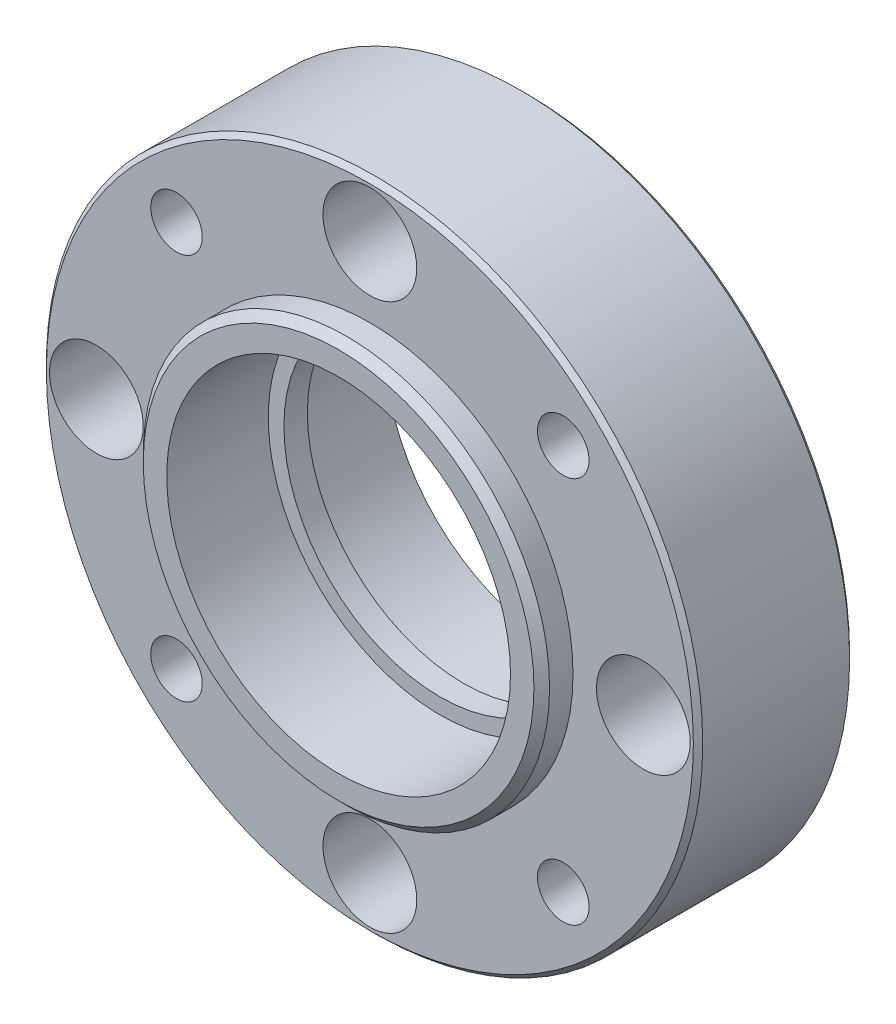
ISO-10303-21;
HEADER;
FILE_DESCRIPTION(('STEP AP214'),'2;1');
FILE_NAME('part.step','',(''),(''),'','','');
FILE_SCHEMA(('AUTOMOTIVE_DESIGN { 1 0 10303 214 1 1 1 1 }'));
ENDSEC;
DATA;
#1=APPLICATION_CONTEXT('core data for automotive mechanical design processes');
#2=APPLICATION_PROTOCOL_DEFINITION('international standard','automotive_design',2000,#1);
#3=PRODUCT_CONTEXT('',#1,'mechanical');
#4=PRODUCT('Part','Part','',(#3));
#5=PRODUCT_RELATED_PRODUCT_CATEGORY('part','',(#4));
#6=PRODUCT_DEFINITION_FORMATION('','',#4);
#7=PRODUCT_DEFINITION_CONTEXT('part definition',#1,'design');
#8=PRODUCT_DEFINITION('design','',#6,#7);
#9=PRODUCT_DEFINITION_SHAPE('','',#8);
#10=(LENGTH_UNIT() NAMED_UNIT(*) SI_UNIT(.MILLI.,.METRE.));
#11=(NAMED_UNIT(*) PLANE_ANGLE_UNIT() SI_UNIT($,.RADIAN.));
#12=(NAMED_UNIT(*) SI_UNIT($,.STERADIAN.) SOLID_ANGLE_UNIT());
#13=UNCERTAINTY_MEASURE_WITH_UNIT(LENGTH_MEASURE(1.E-05),#10,'distance_accuracy_value','');
#14=(GEOMETRIC_REPRESENTATION_CONTEXT(3) GLOBAL_UNCERTAINTY_ASSIGNED_CONTEXT((#13)) GLOBAL_UNIT_ASSIGNED_CONTEXT((#10,
#11,#12)) REPRESENTATION_CONTEXT('',''));
#15=CARTESIAN_POINT('',(0.,0.,0.));
#16=DIRECTION('',(0.,0.,1.));
#17=DIRECTION('',(1.,0.,0.));
#18=AXIS2_PLACEMENT_3D('',#15,#16,#17);
#19=CARTESIAN_POINT('',(0.,0.,-5.));
#20=DIRECTION('',(0.,0.,1.));
#21=DIRECTION('',(1.,0.,0.));
#22=AXIS2_PLACEMENT_3D('',#19,#20,#21);
#23=CYLINDRICAL_SURFACE('',#22,21.);
#24=CARTESIAN_POINT('',(0.,0.,-4.7));
#25=DIRECTION('',(0.,0.,-1.));
#26=DIRECTION('',(-1.,0.,0.));
#27=AXIS2_PLACEMENT_3D('',#24,#25,#26);
#28=CIRCLE('',#27,21.);
#29=CARTESIAN_POINT('',(21.,0.,-4.7));
#30=VERTEX_POINT('',#29);
#31=EDGE_CURVE('E60',#30,#30,#28,.F.);
#32=ORIENTED_EDGE('',*,*,#31,.T.);
#33=EDGE_LOOP('',(#32));
#34=FACE_BOUND('',#33,.T.);
#35=CARTESIAN_POINT('',(0.,0.,4.7));
#36=DIRECTION('',(0.,0.,1.));
#37=DIRECTION('',(1.,0.,0.));
#38=AXIS2_PLACEMENT_3D('',#35,#36,#37);
#39=CIRCLE('',#38,21.);
#40=CARTESIAN_POINT('',(21.,0.,4.7));
#41=VERTEX_POINT('',#40);
#42=EDGE_CURVE('E63',#41,#41,#39,.F.);
#43=ORIENTED_EDGE('',*,*,#42,.T.);
#44=EDGE_LOOP('',(#43));
#45=FACE_BOUND('',#44,.T.);
#46=ADVANCED_FACE('F34',(#34,#45),#23,.T.);
#47=CARTESIAN_POINT('',(21.,0.,-5.));
#48=DIRECTION('',(0.,0.,-1.));
#49=DIRECTION('',(-1.,0.,0.));
#50=AXIS2_PLACEMENT_3D('',#47,#48,#49);
#51=PLANE('',#50);
#52=CARTESIAN_POINT('',(0.,0.,-5.));
#53=DIRECTION('',(0.,0.,-1.));
#54=DIRECTION('',(-1.,0.,0.));
#55=AXIS2_PLACEMENT_3D('',#52,#53,#54);
#56=CIRCLE('',#55,20.7);
#57=CARTESIAN_POINT('',(20.7,0.,-5.));
#58=VERTEX_POINT('',#57);
#59=EDGE_CURVE('E57',#58,#58,#56,.T.);
#60=ORIENTED_EDGE('',*,*,#59,.T.);
#61=EDGE_LOOP('',(#60));
#62=FACE_BOUND('',#61,.T.);
#63=CARTESIAN_POINT('',(-12.3743686707646,12.3743686707646,-5.));
#64=DIRECTION('',(0.,0.,-1.));
#65=DIRECTION('',(-1.,0.,0.));
#66=AXIS2_PLACEMENT_3D('',#63,#64,#65);
#67=CIRCLE('',#66,1.64999999999999);
#68=CARTESIAN_POINT('',(-14.0243686707646,12.3743686707646,-5.));
#69=VERTEX_POINT('',#68);
#70=EDGE_CURVE('E159',#69,#69,#67,.T.);
#71=ORIENTED_EDGE('',*,*,#70,.F.);
#72=EDGE_LOOP('',(#71));
#73=FACE_BOUND('',#72,.T.);
#74=CARTESIAN_POINT('',(12.3743686707646,12.3743686707646,-5.));
#75=DIRECTION('',(0.,0.,-1.));
#76=DIRECTION('',(-1.,0.,0.));
#77=AXIS2_PLACEMENT_3D('',#74,#75,#76);
#78=CIRCLE('',#77,1.64999999999999);
#79=CARTESIAN_POINT('',(10.7243686707646,12.3743686707646,-5.));
#80=VERTEX_POINT('',#79);
#81=EDGE_CURVE('E71',#80,#80,#78,.T.);
#82=ORIENTED_EDGE('',*,*,#81,.F.);
#83=EDGE_LOOP('',(#82));
#84=FACE_BOUND('',#83,.T.);
#85=CARTESIAN_POINT('',(12.3743686707646,-12.3743686707646,-5.));
#86=DIRECTION('',(0.,0.,-1.));
#87=DIRECTION('',(-1.,0.,0.));
#88=AXIS2_PLACEMENT_3D('',#85,#86,#87);
#89=CIRCLE('',#88,1.64999999999999);
#90=CARTESIAN_POINT('',(10.7243686707646,-12.3743686707646,-5.));
#91=VERTEX_POINT('',#90);
#92=EDGE_CURVE('E70',#91,#91,#89,.T.);
#93=ORIENTED_EDGE('',*,*,#92,.F.);
#94=EDGE_LOOP('',(#93));
#95=FACE_BOUND('',#94,.T.);
#96=CARTESIAN_POINT('',(-12.3743686707646,-12.3743686707646,-5.));
#97=DIRECTION('',(0.,0.,-1.));
#98=DIRECTION('',(-1.,0.,0.));
#99=AXIS2_PLACEMENT_3D('',#96,#97,#98);
#100=CIRCLE('',#99,1.64999999999999);
#101=CARTESIAN_POINT('',(-14.0243686707646,-12.3743686707646,-5.));
#102=VERTEX_POINT('',#101);
#103=EDGE_CURVE('E75',#102,#102,#100,.T.);
#104=ORIENTED_EDGE('',*,*,#103,.F.);
#105=EDGE_LOOP('',(#104));
#106=FACE_BOUND('',#105,.T.);
#107=CARTESIAN_POINT('',(0.,17.5,-5.));
#108=DIRECTION('',(0.,0.,-1.));
#109=DIRECTION('',(-1.,0.,0.));
#110=AXIS2_PLACEMENT_3D('',#107,#108,#109);
#111=CIRCLE('',#110,1.75000000000001);
#112=CARTESIAN_POINT('',(-1.75000000000001,17.5,-5.));
#113=VERTEX_POINT('',#112);
#114=EDGE_CURVE('E76',#113,#113,#111,.T.);
#115=ORIENTED_EDGE('',*,*,#114,.F.);
#116=EDGE_LOOP('',(#115));
#117=FACE_BOUND('',#116,.T.);
#118=CARTESIAN_POINT('',(17.5,0.,-5.));
#119=DIRECTION('',(0.,0.,-1.));
#120=DIRECTION('',(-1.,0.,0.));
#121=AXIS2_PLACEMENT_3D('',#118,#119,#120);
#122=CIRCLE('',#121,1.75000000000001);
#123=CARTESIAN_POINT('',(15.75,0.,-5.));
#124=VERTEX_POINT('',#123);
#125=EDGE_CURVE('E81',#124,#124,#122,.T.);
#126=ORIENTED_EDGE('',*,*,#125,.F.);
#127=EDGE_LOOP('',(#126));
#128=FACE_BOUND('',#127,.T.);
#129=CARTESIAN_POINT('',(0.,-17.5,-5.));
#130=DIRECTION('',(0.,0.,-1.));
#131=DIRECTION('',(-1.,0.,0.));
#132=AXIS2_PLACEMENT_3D('',#129,#130,#131);
#133=CIRCLE('',#132,1.75000000000001);
#134=CARTESIAN_POINT('',(-1.75000000000001,-17.5,-5.));
#135=VERTEX_POINT('',#134);
#136=EDGE_CURVE('E86',#135,#135,#133,.T.);
#137=ORIENTED_EDGE('',*,*,#136,.F.);
#138=EDGE_LOOP('',(#137));
#139=FACE_BOUND('',#138,.T.);
#140=CARTESIAN_POINT('',(-17.5,0.,-5.));
#141=DIRECTION('',(0.,0.,-1.));
#142=DIRECTION('',(-1.,0.,0.));
#143=AXIS2_PLACEMENT_3D('',#140,#141,#142);
#144=CIRCLE('',#143,1.75000000000001);
#145=CARTESIAN_POINT('',(-19.25,0.,-5.));
#146=VERTEX_POINT('',#145);
#147=EDGE_CURVE('E91',#146,#146,#144,.T.);
#148=ORIENTED_EDGE('',*,*,#147,.F.);
#149=EDGE_LOOP('',(#148));
#150=FACE_BOUND('',#149,.T.);
#151=CARTESIAN_POINT('',(0.,0.,-5.));
#152=DIRECTION('',(0.,0.,-1.));
#153=DIRECTION('',(-1.,0.,0.));
#154=AXIS2_PLACEMENT_3D('',#151,#152,#153);
#155=CIRCLE('',#154,13.4);
#156=CARTESIAN_POINT('',(-13.4,0.,-5.));
#157=VERTEX_POINT('',#156);
#158=EDGE_CURVE('E96',#157,#157,#155,.T.);
#159=ORIENTED_EDGE('',*,*,#158,.F.);
#160=EDGE_LOOP('',(#159));
#161=FACE_BOUND('',#160,.T.);
#162=ADVANCED_FACE('F165',(#62,#73,#84,#95,#106,#117,#128,#139,#150,#161),#51,.T.);
#163=CARTESIAN_POINT('',(0.,0.,5.));
#164=DIRECTION('',(0.,0.,1.));
#165=DIRECTION('',(1.,0.,0.));
#166=AXIS2_PLACEMENT_3D('',#163,#164,#165);
#167=PLANE('',#166);
#168=CARTESIAN_POINT('',(0.,0.,5.));
#169=DIRECTION('',(0.,0.,1.));
#170=DIRECTION('',(1.,0.,0.));
#171=AXIS2_PLACEMENT_3D('',#168,#169,#170);
#172=CIRCLE('',#171,20.7);
#173=CARTESIAN_POINT('',(20.7,0.,5.));
#174=VERTEX_POINT('',#173);
#175=EDGE_CURVE('E54',#174,#174,#172,.T.);
#176=ORIENTED_EDGE('',*,*,#175,.T.);
#177=EDGE_LOOP('',(#176));
#178=FACE_BOUND('',#177,.T.);
#179=CARTESIAN_POINT('',(-12.3743686707646,12.3743686707646,5.));
#180=DIRECTION('',(0.,0.,1.));
#181=DIRECTION('',(1.,0.,0.));
#182=AXIS2_PLACEMENT_3D('',#179,#180,#181);
#183=CIRCLE('',#182,1.64999999999999);
#184=CARTESIAN_POINT('',(-10.7243686707646,12.3743686707646,5.));
#185=VERTEX_POINT('',#184);
#186=EDGE_CURVE('E156',#185,#185,#183,.T.);
#187=ORIENTED_EDGE('',*,*,#186,.F.);
#188=EDGE_LOOP('',(#187));
#189=FACE_BOUND('',#188,.T.);
#190=CARTESIAN_POINT('',(12.3743686707646,12.3743686707646,5.));
#191=DIRECTION('',(0.,0.,1.));
#192=DIRECTION('',(1.,0.,0.));
#193=AXIS2_PLACEMENT_3D('',#190,#191,#192);
#194=CIRCLE('',#193,1.64999999999999);
#195=CARTESIAN_POINT('',(14.0243686707646,12.3743686707646,5.));
#196=VERTEX_POINT('',#195);
#197=EDGE_CURVE('E67',#196,#196,#194,.T.);
#198=ORIENTED_EDGE('',*,*,#197,.F.);
#199=EDGE_LOOP('',(#198));
#200=FACE_BOUND('',#199,.T.);
#201=CARTESIAN_POINT('',(12.3743686707646,-12.3743686707646,5.));
#202=DIRECTION('',(0.,0.,1.));
#203=DIRECTION('',(1.,0.,0.));
#204=AXIS2_PLACEMENT_3D('',#201,#202,#203);
#205=CIRCLE('',#204,1.64999999999999);
#206=CARTESIAN_POINT('',(14.0243686707646,-12.3743686707646,5.));
#207=VERTEX_POINT('',#206);
#208=EDGE_CURVE('E72',#207,#207,#205,.T.);
#209=ORIENTED_EDGE('',*,*,#208,.F.);
#210=EDGE_LOOP('',(#209));
#211=FACE_BOUND('',#210,.T.);
#212=CARTESIAN_POINT('',(-12.3743686707646,-12.3743686707646,5.));
#213=DIRECTION('',(0.,0.,1.));
#214=DIRECTION('',(1.,0.,0.));
#215=AXIS2_PLACEMENT_3D('',#212,#213,#214);
#216=CIRCLE('',#215,1.64999999999999);
#217=CARTESIAN_POINT('',(-10.7243686707646,-12.3743686707646,5.));
#218=VERTEX_POINT('',#217);
#219=EDGE_CURVE('E147',#218,#218,#216,.T.);
#220=ORIENTED_EDGE('',*,*,#219,.F.);
#221=EDGE_LOOP('',(#220));
#222=FACE_BOUND('',#221,.T.);
#223=CARTESIAN_POINT('',(0.,17.5,5.));
#224=DIRECTION('',(0.,0.,1.));
#225=DIRECTION('',(1.,0.,0.));
#226=AXIS2_PLACEMENT_3D('',#223,#224,#225);
#227=CIRCLE('',#226,3.);
#228=CARTESIAN_POINT('',(3.,17.5,5.));
#229=VERTEX_POINT('',#228);
#230=EDGE_CURVE('E144',#229,#229,#227,.T.);
#231=ORIENTED_EDGE('',*,*,#230,.F.);
#232=EDGE_LOOP('',(#231));
#233=FACE_BOUND('',#232,.T.);
#234=CARTESIAN_POINT('',(17.5,0.,5.));
#235=DIRECTION('',(0.,0.,1.));
#236=DIRECTION('',(1.,0.,0.));
#237=AXIS2_PLACEMENT_3D('',#234,#235,#236);
#238=CIRCLE('',#237,3.);
#239=CARTESIAN_POINT('',(20.5,0.,5.));
#240=VERTEX_POINT('',#239);
#241=EDGE_CURVE('E79',#240,#240,#238,.T.);
#242=ORIENTED_EDGE('',*,*,#241,.F.);
#243=EDGE_LOOP('',(#242));
#244=FACE_BOUND('',#243,.T.);
#245=CARTESIAN_POINT('',(0.,-17.5,5.));
#246=DIRECTION('',(0.,0.,1.));
#247=DIRECTION('',(1.,0.,0.));
#248=AXIS2_PLACEMENT_3D('',#245,#246,#247);
#249=CIRCLE('',#248,3.);
#250=CARTESIAN_POINT('',(3.,-17.5,5.));
#251=VERTEX_POINT('',#250);
#252=EDGE_CURVE('E84',#251,#251,#249,.T.);
#253=ORIENTED_EDGE('',*,*,#252,.F.);
#254=EDGE_LOOP('',(#253));
#255=FACE_BOUND('',#254,.T.);
#256=CARTESIAN_POINT('',(-17.5,0.,5.));
#257=DIRECTION('',(0.,0.,1.));
#258=DIRECTION('',(1.,0.,0.));
#259=AXIS2_PLACEMENT_3D('',#256,#257,#258);
#260=CIRCLE('',#259,3.);
#261=CARTESIAN_POINT('',(-14.5,0.,5.));
#262=VERTEX_POINT('',#261);
#263=EDGE_CURVE('E89',#262,#262,#260,.T.);
#264=ORIENTED_EDGE('',*,*,#263,.F.);
#265=EDGE_LOOP('',(#264));
#266=FACE_BOUND('',#265,.T.);
#267=CARTESIAN_POINT('',(0.,0.,5.));
#268=DIRECTION('',(0.,0.,1.));
#269=DIRECTION('',(1.,0.,0.));
#270=AXIS2_PLACEMENT_3D('',#267,#268,#269);
#271=CIRCLE('',#270,13.);
#272=CARTESIAN_POINT('',(13.,0.,5.));
#273=VERTEX_POINT('',#272);
#274=EDGE_CURVE('E66',#273,#273,#271,.T.);
#275=ORIENTED_EDGE('',*,*,#274,.F.);
#276=EDGE_LOOP('',(#275));
#277=FACE_BOUND('',#276,.T.);
#278=ADVANCED_FACE('F168',(#178,#189,#200,#211,#222,#233,#244,#255,#266,#277),#167,.T.);
#279=CARTESIAN_POINT('',(0.,0.,-7.));
#280=DIRECTION('',(0.,0.,1.));
#281=DIRECTION('',(1.,0.,0.));
#282=AXIS2_PLACEMENT_3D('',#279,#280,#281);
#283=CYLINDRICAL_SURFACE('',#282,13.4);
#284=CARTESIAN_POINT('',(0.,0.,-6.5));
#285=DIRECTION('',(0.,0.,-1.));
#286=DIRECTION('',(-1.,0.,0.));
#287=AXIS2_PLACEMENT_3D('',#284,#285,#286);
#288=CIRCLE('',#287,13.4);
#289=CARTESIAN_POINT('',(-13.4,0.,-6.5));
#290=VERTEX_POINT('',#289);
#291=EDGE_CURVE('E10',#290,#290,#288,.F.);
#292=ORIENTED_EDGE('',*,*,#291,.T.);
#293=EDGE_LOOP('',(#292));
#294=FACE_BOUND('',#293,.T.);
#295=ORIENTED_EDGE('',*,*,#158,.T.);
#296=EDGE_LOOP('',(#295));
#297=FACE_BOUND('',#296,.T.);
#298=ADVANCED_FACE('F187',(#294,#297),#283,.T.);
#299=CARTESIAN_POINT('',(0.,0.,-7.));
#300=DIRECTION('',(0.,0.,-1.));
#301=DIRECTION('',(-1.,0.,0.));
#302=AXIS2_PLACEMENT_3D('',#299,#300,#301);
#303=PLANE('',#302);
#304=CARTESIAN_POINT('',(0.,0.,-7.));
#305=DIRECTION('',(0.,0.,-1.));
#306=DIRECTION('',(-1.,0.,0.));
#307=AXIS2_PLACEMENT_3D('',#304,#305,#306);
#308=CIRCLE('',#307,12.9);
#309=CARTESIAN_POINT('',(-12.9,0.,-7.));
#310=VERTEX_POINT('',#309);
#311=EDGE_CURVE('E41',#310,#310,#308,.T.);
#312=ORIENTED_EDGE('',*,*,#311,.T.);
#313=EDGE_LOOP('',(#312));
#314=FACE_BOUND('',#313,.T.);
#315=CARTESIAN_POINT('',(0.,0.,-7.));
#316=DIRECTION('',(0.,0.,1.));
#317=DIRECTION('',(1.,0.,0.));
#318=AXIS2_PLACEMENT_3D('',#315,#316,#317);
#319=CIRCLE('',#318,11.);
#320=CARTESIAN_POINT('',(11.,0.,-7.));
#321=VERTEX_POINT('',#320);
#322=EDGE_CURVE('E99',#321,#321,#319,.T.);
#323=ORIENTED_EDGE('',*,*,#322,.T.);
#324=EDGE_LOOP('',(#323));
#325=FACE_BOUND('',#324,.T.);
#326=ADVANCED_FACE('F189',(#314,#325),#303,.T.);
#327=CARTESIAN_POINT('',(0.,0.,7.));
#328=DIRECTION('',(0.,0.,-1.));
#329=DIRECTION('',(-1.,0.,0.));
#330=AXIS2_PLACEMENT_3D('',#327,#328,#329);
#331=CYLINDRICAL_SURFACE('',#330,13.);
#332=CARTESIAN_POINT('',(0.,0.,6.5));
#333=DIRECTION('',(0.,0.,1.));
#334=DIRECTION('',(1.,0.,0.));
#335=AXIS2_PLACEMENT_3D('',#332,#333,#334);
#336=CIRCLE('',#335,13.);
#337=CARTESIAN_POINT('',(13.,0.,6.5));
#338=VERTEX_POINT('',#337);
#339=EDGE_CURVE('E45',#338,#338,#336,.F.);
#340=ORIENTED_EDGE('',*,*,#339,.T.);
#341=EDGE_LOOP('',(#340));
#342=FACE_BOUND('',#341,.T.);
#343=ORIENTED_EDGE('',*,*,#274,.T.);
#344=EDGE_LOOP('',(#343));
#345=FACE_BOUND('',#344,.T.);
#346=ADVANCED_FACE('F195',(#342,#345),#331,.T.);
#347=CARTESIAN_POINT('',(0.,0.,7.));
#348=DIRECTION('',(0.,0.,1.));
#349=DIRECTION('',(1.,0.,0.));
#350=AXIS2_PLACEMENT_3D('',#347,#348,#349);
#351=PLANE('',#350);
#352=CARTESIAN_POINT('',(0.,0.,7.));
#353=DIRECTION('',(0.,0.,1.));
#354=DIRECTION('',(1.,0.,0.));
#355=AXIS2_PLACEMENT_3D('',#352,#353,#354);
#356=CIRCLE('',#355,12.5);
#357=CARTESIAN_POINT('',(12.5,0.,7.));
#358=VERTEX_POINT('',#357);
#359=EDGE_CURVE('E49',#358,#358,#356,.T.);
#360=ORIENTED_EDGE('',*,*,#359,.T.);
#361=EDGE_LOOP('',(#360));
#362=FACE_BOUND('',#361,.T.);
#363=CARTESIAN_POINT('',(0.,0.,7.));
#364=DIRECTION('',(0.,0.,1.));
#365=DIRECTION('',(1.,0.,0.));
#366=AXIS2_PLACEMENT_3D('',#363,#364,#365);
#367=CIRCLE('',#366,11.);
#368=CARTESIAN_POINT('',(11.,0.,7.));
#369=VERTEX_POINT('',#368);
#370=EDGE_CURVE('E104',#369,#369,#367,.T.);
#371=ORIENTED_EDGE('',*,*,#370,.F.);
#372=EDGE_LOOP('',(#371));
#373=FACE_BOUND('',#372,.T.);
#374=ADVANCED_FACE('F224',(#362,#373),#351,.T.);
#375=CARTESIAN_POINT('',(0.,0.,-7.));
#376=DIRECTION('',(0.,0.,1.));
#377=DIRECTION('',(1.,0.,0.));
#378=AXIS2_PLACEMENT_3D('',#375,#376,#377);
#379=CYLINDRICAL_SURFACE('',#378,11.);
#380=ORIENTED_EDGE('',*,*,#322,.F.);
#381=EDGE_LOOP('',(#380));
#382=FACE_BOUND('',#381,.T.);
#383=CARTESIAN_POINT('',(0.,0.,-1.));
#384=DIRECTION('',(0.,0.,1.));
#385=DIRECTION('',(1.,0.,0.));
#386=AXIS2_PLACEMENT_3D('',#383,#384,#385);
#387=CIRCLE('',#386,11.);
#388=CARTESIAN_POINT('',(11.,0.,-1.));
#389=VERTEX_POINT('',#388);
#390=EDGE_CURVE('E94',#389,#389,#387,.T.);
#391=ORIENTED_EDGE('',*,*,#390,.T.);
#392=EDGE_LOOP('',(#391));
#393=FACE_BOUND('',#392,.T.);
#394=ADVANCED_FACE('F227',(#382,#393),#379,.F.);
#395=CARTESIAN_POINT('',(0.,0.,-7.));
#396=DIRECTION('',(0.,0.,1.));
#397=DIRECTION('',(1.,0.,0.));
#398=AXIS2_PLACEMENT_3D('',#395,#396,#397);
#399=CYLINDRICAL_SURFACE('',#398,11.);
#400=CARTESIAN_POINT('',(0.,0.,0.5));
#401=DIRECTION('',(0.,0.,1.));
#402=DIRECTION('',(1.,0.,0.));
#403=AXIS2_PLACEMENT_3D('',#400,#401,#402);
#404=CIRCLE('',#403,11.);
#405=CARTESIAN_POINT('',(11.,0.,0.5));
#406=VERTEX_POINT('',#405);
#407=EDGE_CURVE('E107',#406,#406,#404,.T.);
#408=ORIENTED_EDGE('',*,*,#407,.F.);
#409=EDGE_LOOP('',(#408));
#410=FACE_BOUND('',#409,.T.);
#411=ORIENTED_EDGE('',*,*,#370,.T.);
#412=EDGE_LOOP('',(#411));
#413=FACE_BOUND('',#412,.T.);
#414=ADVANCED_FACE('F231',(#410,#413),#399,.F.);
#415=CARTESIAN_POINT('',(11.,0.,0.499999999999999));
#416=DIRECTION('',(0.,0.,-1.));
#417=DIRECTION('',(-1.,0.,0.));
#418=AXIS2_PLACEMENT_3D('',#415,#416,#417);
#419=PLANE('',#418);
#420=CARTESIAN_POINT('',(0.,0.,0.499999999999997));
#421=DIRECTION('',(0.,0.,1.));
#422=DIRECTION('',(1.,0.,0.));
#423=AXIS2_PLACEMENT_3D('',#420,#421,#422);
#424=CIRCLE('',#423,10.);
#425=CARTESIAN_POINT('',(10.,0.,0.499999999999997));
#426=VERTEX_POINT('',#425);
#427=EDGE_CURVE('E110',#426,#426,#424,.T.);
#428=ORIENTED_EDGE('',*,*,#427,.F.);
#429=EDGE_LOOP('',(#428));
#430=FACE_BOUND('',#429,.T.);
#431=ORIENTED_EDGE('',*,*,#407,.T.);
#432=EDGE_LOOP('',(#431));
#433=FACE_BOUND('',#432,.T.);
#434=ADVANCED_FACE('F233',(#430,#433),#419,.F.);
#435=CARTESIAN_POINT('',(0.,0.,-7.));
#436=DIRECTION('',(0.,0.,1.));
#437=DIRECTION('',(1.,0.,0.));
#438=AXIS2_PLACEMENT_3D('',#435,#436,#437);
#439=CYLINDRICAL_SURFACE('',#438,10.);
#440=CARTESIAN_POINT('',(0.,0.,-1.));
#441=DIRECTION('',(0.,0.,1.));
#442=DIRECTION('',(1.,0.,0.));
#443=AXIS2_PLACEMENT_3D('',#440,#441,#442);
#444=CIRCLE('',#443,10.);
#445=CARTESIAN_POINT('',(10.,0.,-1.));
#446=VERTEX_POINT('',#445);
#447=EDGE_CURVE('E113',#446,#446,#444,.T.);
#448=ORIENTED_EDGE('',*,*,#447,.F.);
#449=EDGE_LOOP('',(#448));
#450=FACE_BOUND('',#449,.T.);
#451=ORIENTED_EDGE('',*,*,#427,.T.);
#452=EDGE_LOOP('',(#451));
#453=FACE_BOUND('',#452,.T.);
#454=ADVANCED_FACE('F240',(#450,#453),#439,.F.);
#455=CARTESIAN_POINT('',(10.,0.,-1.));
#456=DIRECTION('',(0.,0.,1.));
#457=DIRECTION('',(1.,0.,0.));
#458=AXIS2_PLACEMENT_3D('',#455,#456,#457);
#459=PLANE('',#458);
#460=ORIENTED_EDGE('',*,*,#390,.F.);
#461=EDGE_LOOP('',(#460));
#462=FACE_BOUND('',#461,.T.);
#463=ORIENTED_EDGE('',*,*,#447,.T.);
#464=EDGE_LOOP('',(#463));
#465=FACE_BOUND('',#464,.T.);
#466=ADVANCED_FACE('F284',(#462,#465),#459,.F.);
#467=CARTESIAN_POINT('',(-17.5,0.,5.));
#468=DIRECTION('',(0.,0.,1.));
#469=DIRECTION('',(1.,0.,0.));
#470=AXIS2_PLACEMENT_3D('',#467,#468,#469);
#471=CYLINDRICAL_SURFACE('',#470,1.75000000000001);
#472=ORIENTED_EDGE('',*,*,#147,.T.);
#473=EDGE_LOOP('',(#472));
#474=FACE_BOUND('',#473,.T.);
#475=CARTESIAN_POINT('',(-17.5,0.,0.));
#476=DIRECTION('',(0.,0.,1.));
#477=DIRECTION('',(1.,0.,0.));
#478=AXIS2_PLACEMENT_3D('',#475,#476,#477);
#479=CIRCLE('',#478,1.75000000000001);
#480=CARTESIAN_POINT('',(-15.75,0.,0.));
#481=VERTEX_POINT('',#480);
#482=EDGE_CURVE('E95',#481,#481,#479,.T.);
#483=ORIENTED_EDGE('',*,*,#482,.T.);
#484=EDGE_LOOP('',(#483));
#485=FACE_BOUND('',#484,.T.);
#486=ADVANCED_FACE('F293',(#474,#485),#471,.F.);
#487=CARTESIAN_POINT('',(-15.75,0.,0.));
#488=DIRECTION('',(0.,0.,-1.));
#489=DIRECTION('',(-1.,0.,0.));
#490=AXIS2_PLACEMENT_3D('',#487,#488,#489);
#491=PLANE('',#490);
#492=ORIENTED_EDGE('',*,*,#482,.F.);
#493=EDGE_LOOP('',(#492));
#494=FACE_BOUND('',#493,.T.);
#495=CARTESIAN_POINT('',(-17.5,0.,0.));
#496=DIRECTION('',(0.,0.,1.));
#497=DIRECTION('',(1.,0.,0.));
#498=AXIS2_PLACEMENT_3D('',#495,#496,#497);
#499=CIRCLE('',#498,3.);
#500=CARTESIAN_POINT('',(-14.5,0.,0.));
#501=VERTEX_POINT('',#500);
#502=EDGE_CURVE('E120',#501,#501,#499,.T.);
#503=ORIENTED_EDGE('',*,*,#502,.T.);
#504=EDGE_LOOP('',(#503));
#505=FACE_BOUND('',#504,.T.);
#506=ADVANCED_FACE('F303',(#494,#505),#491,.F.);
#507=CARTESIAN_POINT('',(-17.5,0.,5.));
#508=DIRECTION('',(0.,0.,1.));
#509=DIRECTION('',(1.,0.,0.));
#510=AXIS2_PLACEMENT_3D('',#507,#508,#509);
#511=CYLINDRICAL_SURFACE('',#510,3.);
#512=ORIENTED_EDGE('',*,*,#502,.F.);
#513=EDGE_LOOP('',(#512));
#514=FACE_BOUND('',#513,.T.);
#515=ORIENTED_EDGE('',*,*,#263,.T.);
#516=EDGE_LOOP('',(#515));
#517=FACE_BOUND('',#516,.T.);
#518=ADVANCED_FACE('F313',(#514,#517),#511,.F.);
#519=CARTESIAN_POINT('',(0.,-17.5,5.));
#520=DIRECTION('',(0.,0.,1.));
#521=DIRECTION('',(1.,0.,0.));
#522=AXIS2_PLACEMENT_3D('',#519,#520,#521);
#523=CYLINDRICAL_SURFACE('',#522,1.75000000000001);
#524=ORIENTED_EDGE('',*,*,#136,.T.);
#525=EDGE_LOOP('',(#524));
#526=FACE_BOUND('',#525,.T.);
#527=CARTESIAN_POINT('',(0.,-17.5,0.));
#528=DIRECTION('',(0.,0.,1.));
#529=DIRECTION('',(1.,0.,0.));
#530=AXIS2_PLACEMENT_3D('',#527,#528,#529);
#531=CIRCLE('',#530,1.75000000000001);
#532=CARTESIAN_POINT('',(1.75000000000001,-17.5,0.));
#533=VERTEX_POINT('',#532);
#534=EDGE_CURVE('E90',#533,#533,#531,.T.);
#535=ORIENTED_EDGE('',*,*,#534,.T.);
#536=EDGE_LOOP('',(#535));
#537=FACE_BOUND('',#536,.T.);
#538=ADVANCED_FACE('F323',(#526,#537),#523,.F.);
#539=CARTESIAN_POINT('',(1.75000000000001,-17.5,0.));
#540=DIRECTION('',(0.,0.,-1.));
#541=DIRECTION('',(-1.,0.,0.));
#542=AXIS2_PLACEMENT_3D('',#539,#540,#541);
#543=PLANE('',#542);
#544=ORIENTED_EDGE('',*,*,#534,.F.);
#545=EDGE_LOOP('',(#544));
#546=FACE_BOUND('',#545,.T.);
#547=CARTESIAN_POINT('',(0.,-17.5,0.));
#548=DIRECTION('',(0.,0.,1.));
#549=DIRECTION('',(1.,0.,0.));
#550=AXIS2_PLACEMENT_3D('',#547,#548,#549);
#551=CIRCLE('',#550,3.);
#552=CARTESIAN_POINT('',(3.,-17.5,0.));
#553=VERTEX_POINT('',#552);
#554=EDGE_CURVE('E127',#553,#553,#551,.T.);
#555=ORIENTED_EDGE('',*,*,#554,.T.);
#556=EDGE_LOOP('',(#555));
#557=FACE_BOUND('',#556,.T.);
#558=ADVANCED_FACE('F333',(#546,#557),#543,.F.);
#559=CARTESIAN_POINT('',(0.,-17.5,5.));
#560=DIRECTION('',(0.,0.,1.));
#561=DIRECTION('',(1.,0.,0.));
#562=AXIS2_PLACEMENT_3D('',#559,#560,#561);
#563=CYLINDRICAL_SURFACE('',#562,3.);
#564=ORIENTED_EDGE('',*,*,#554,.F.);
#565=EDGE_LOOP('',(#564));
#566=FACE_BOUND('',#565,.T.);
#567=ORIENTED_EDGE('',*,*,#252,.T.);
#568=EDGE_LOOP('',(#567));
#569=FACE_BOUND('',#568,.T.);
#570=ADVANCED_FACE('F343',(#566,#569),#563,.F.);
#571=CARTESIAN_POINT('',(17.5,0.,5.));
#572=DIRECTION('',(0.,0.,1.));
#573=DIRECTION('',(1.,0.,0.));
#574=AXIS2_PLACEMENT_3D('',#571,#572,#573);
#575=CYLINDRICAL_SURFACE('',#574,1.75000000000001);
#576=ORIENTED_EDGE('',*,*,#125,.T.);
#577=EDGE_LOOP('',(#576));
#578=FACE_BOUND('',#577,.T.);
#579=CARTESIAN_POINT('',(17.5,0.,0.));
#580=DIRECTION('',(0.,0.,1.));
#581=DIRECTION('',(1.,0.,0.));
#582=AXIS2_PLACEMENT_3D('',#579,#580,#581);
#583=CIRCLE('',#582,1.75000000000001);
#584=CARTESIAN_POINT('',(19.25,0.,0.));
#585=VERTEX_POINT('',#584);
#586=EDGE_CURVE('E85',#585,#585,#583,.T.);
#587=ORIENTED_EDGE('',*,*,#586,.T.);
#588=EDGE_LOOP('',(#587));
#589=FACE_BOUND('',#588,.T.);
#590=ADVANCED_FACE('F353',(#578,#589),#575,.F.);
#591=CARTESIAN_POINT('',(19.25,0.,0.));
#592=DIRECTION('',(0.,0.,-1.));
#593=DIRECTION('',(-1.,0.,0.));
#594=AXIS2_PLACEMENT_3D('',#591,#592,#593);
#595=PLANE('',#594);
#596=ORIENTED_EDGE('',*,*,#586,.F.);
#597=EDGE_LOOP('',(#596));
#598=FACE_BOUND('',#597,.T.);
#599=CARTESIAN_POINT('',(17.5,0.,0.));
#600=DIRECTION('',(0.,0.,1.));
#601=DIRECTION('',(1.,0.,0.));
#602=AXIS2_PLACEMENT_3D('',#599,#600,#601);
#603=CIRCLE('',#602,3.);
#604=CARTESIAN_POINT('',(20.5,0.,0.));
#605=VERTEX_POINT('',#604);
#606=EDGE_CURVE('E134',#605,#605,#603,.T.);
#607=ORIENTED_EDGE('',*,*,#606,.T.);
#608=EDGE_LOOP('',(#607));
#609=FACE_BOUND('',#608,.T.);
#610=ADVANCED_FACE('F363',(#598,#609),#595,.F.);
#611=CARTESIAN_POINT('',(17.5,0.,5.));
#612=DIRECTION('',(0.,0.,1.));
#613=DIRECTION('',(1.,0.,0.));
#614=AXIS2_PLACEMENT_3D('',#611,#612,#613);
#615=CYLINDRICAL_SURFACE('',#614,3.);
#616=ORIENTED_EDGE('',*,*,#606,.F.);
#617=EDGE_LOOP('',(#616));
#618=FACE_BOUND('',#617,.T.);
#619=ORIENTED_EDGE('',*,*,#241,.T.);
#620=EDGE_LOOP('',(#619));
#621=FACE_BOUND('',#620,.T.);
#622=ADVANCED_FACE('F373',(#618,#621),#615,.F.);
#623=CARTESIAN_POINT('',(0.,17.5,5.));
#624=DIRECTION('',(0.,0.,1.));
#625=DIRECTION('',(1.,0.,0.));
#626=AXIS2_PLACEMENT_3D('',#623,#624,#625);
#627=CYLINDRICAL_SURFACE('',#626,1.75000000000001);
#628=ORIENTED_EDGE('',*,*,#114,.T.);
#629=EDGE_LOOP('',(#628));
#630=FACE_BOUND('',#629,.T.);
#631=CARTESIAN_POINT('',(0.,17.5,0.));
#632=DIRECTION('',(0.,0.,1.));
#633=DIRECTION('',(1.,0.,0.));
#634=AXIS2_PLACEMENT_3D('',#631,#632,#633);
#635=CIRCLE('',#634,1.75000000000001);
#636=CARTESIAN_POINT('',(1.75000000000001,17.5,0.));
#637=VERTEX_POINT('',#636);
#638=EDGE_CURVE('E80',#637,#637,#635,.T.);
#639=ORIENTED_EDGE('',*,*,#638,.T.);
#640=EDGE_LOOP('',(#639));
#641=FACE_BOUND('',#640,.T.);
#642=ADVANCED_FACE('F383',(#630,#641),#627,.F.);
#643=CARTESIAN_POINT('',(1.75000000000001,17.5,0.));
#644=DIRECTION('',(0.,0.,-1.));
#645=DIRECTION('',(-1.,0.,0.));
#646=AXIS2_PLACEMENT_3D('',#643,#644,#645);
#647=PLANE('',#646);
#648=ORIENTED_EDGE('',*,*,#638,.F.);
#649=EDGE_LOOP('',(#648));
#650=FACE_BOUND('',#649,.T.);
#651=CARTESIAN_POINT('',(0.,17.5,0.));
#652=DIRECTION('',(0.,0.,1.));
#653=DIRECTION('',(1.,0.,0.));
#654=AXIS2_PLACEMENT_3D('',#651,#652,#653);
#655=CIRCLE('',#654,3.);
#656=CARTESIAN_POINT('',(3.,17.5,0.));
#657=VERTEX_POINT('',#656);
#658=EDGE_CURVE('E141',#657,#657,#655,.T.);
#659=ORIENTED_EDGE('',*,*,#658,.T.);
#660=EDGE_LOOP('',(#659));
#661=FACE_BOUND('',#660,.T.);
#662=ADVANCED_FACE('F393',(#650,#661),#647,.F.);
#663=CARTESIAN_POINT('',(0.,17.5,5.));
#664=DIRECTION('',(0.,0.,1.));
#665=DIRECTION('',(1.,0.,0.));
#666=AXIS2_PLACEMENT_3D('',#663,#664,#665);
#667=CYLINDRICAL_SURFACE('',#666,3.);
#668=ORIENTED_EDGE('',*,*,#658,.F.);
#669=EDGE_LOOP('',(#668));
#670=FACE_BOUND('',#669,.T.);
#671=ORIENTED_EDGE('',*,*,#230,.T.);
#672=EDGE_LOOP('',(#671));
#673=FACE_BOUND('',#672,.T.);
#674=ADVANCED_FACE('F403',(#670,#673),#667,.F.);
#675=CARTESIAN_POINT('',(-12.3743686707646,-12.3743686707646,-5.));
#676=DIRECTION('',(0.,0.,-1.));
#677=DIRECTION('',(-1.,0.,0.));
#678=AXIS2_PLACEMENT_3D('',#675,#676,#677);
#679=CYLINDRICAL_SURFACE('',#678,1.64999999999999);
#680=ORIENTED_EDGE('',*,*,#219,.T.);
#681=EDGE_LOOP('',(#680));
#682=FACE_BOUND('',#681,.T.);
#683=ORIENTED_EDGE('',*,*,#103,.T.);
#684=EDGE_LOOP('',(#683));
#685=FACE_BOUND('',#684,.T.);
#686=ADVANCED_FACE('F413',(#682,#685),#679,.F.);
#687=CARTESIAN_POINT('',(12.3743686707646,-12.3743686707646,-5.));
#688=DIRECTION('',(0.,0.,-1.));
#689=DIRECTION('',(-1.,0.,0.));
#690=AXIS2_PLACEMENT_3D('',#687,#688,#689);
#691=CYLINDRICAL_SURFACE('',#690,1.64999999999999);
#692=ORIENTED_EDGE('',*,*,#208,.T.);
#693=EDGE_LOOP('',(#692));
#694=FACE_BOUND('',#693,.T.);
#695=ORIENTED_EDGE('',*,*,#92,.T.);
#696=EDGE_LOOP('',(#695));
#697=FACE_BOUND('',#696,.T.);
#698=ADVANCED_FACE('F423',(#694,#697),#691,.F.);
#699=CARTESIAN_POINT('',(12.3743686707646,12.3743686707646,-5.));
#700=DIRECTION('',(0.,0.,-1.));
#701=DIRECTION('',(-1.,0.,0.));
#702=AXIS2_PLACEMENT_3D('',#699,#700,#701);
#703=CYLINDRICAL_SURFACE('',#702,1.64999999999999);
#704=ORIENTED_EDGE('',*,*,#197,.T.);
#705=EDGE_LOOP('',(#704));
#706=FACE_BOUND('',#705,.T.);
#707=ORIENTED_EDGE('',*,*,#81,.T.);
#708=EDGE_LOOP('',(#707));
#709=FACE_BOUND('',#708,.T.);
#710=ADVANCED_FACE('F433',(#706,#709),#703,.F.);
#711=CARTESIAN_POINT('',(-12.3743686707646,12.3743686707646,-5.));
#712=DIRECTION('',(0.,0.,-1.));
#713=DIRECTION('',(-1.,0.,0.));
#714=AXIS2_PLACEMENT_3D('',#711,#712,#713);
#715=CYLINDRICAL_SURFACE('',#714,1.64999999999999);
#716=ORIENTED_EDGE('',*,*,#186,.T.);
#717=EDGE_LOOP('',(#716));
#718=FACE_BOUND('',#717,.T.);
#719=ORIENTED_EDGE('',*,*,#70,.T.);
#720=EDGE_LOOP('',(#719));
#721=FACE_BOUND('',#720,.T.);
#722=ADVANCED_FACE('F163',(#718,#721),#715,.F.);
#723=CARTESIAN_POINT('',(0.,0.,-4.7));
#724=DIRECTION('',(0.,0.,1.));
#725=DIRECTION('',(1.,0.,0.));
#726=AXIS2_PLACEMENT_3D('',#723,#724,#725);
#727=CONICAL_SURFACE('',#726,21.,0.785398163397454);
#728=CARTESIAN_POINT('',(20.7,0.,-5.));
#729=CARTESIAN_POINT('',(20.703125,0.,-4.996875));
#730=CARTESIAN_POINT('',(20.70625,0.,-4.99375));
#731=CARTESIAN_POINT('',(20.7125,0.,-4.9875));
#732=CARTESIAN_POINT('',(20.715625,0.,-4.984375));
#733=CARTESIAN_POINT('',(20.721875,0.,-4.978125));
#734=CARTESIAN_POINT('',(20.725,0.,-4.975));
#735=CARTESIAN_POINT('',(20.73125,0.,-4.96875));
#736=CARTESIAN_POINT('',(20.734375,0.,-4.965625));
#737=CARTESIAN_POINT('',(20.740625,0.,-4.959375));
#738=CARTESIAN_POINT('',(20.74375,0.,-4.95625));
#739=CARTESIAN_POINT('',(20.75,0.,-4.95));
#740=CARTESIAN_POINT('',(20.753125,0.,-4.946875));
#741=CARTESIAN_POINT('',(20.759375,0.,-4.940625));
#742=CARTESIAN_POINT('',(20.7625,0.,-4.9375));
#743=CARTESIAN_POINT('',(20.76875,0.,-4.93125));
#744=CARTESIAN_POINT('',(20.771875,0.,-4.928125));
#745=CARTESIAN_POINT('',(20.778125,0.,-4.921875));
#746=CARTESIAN_POINT('',(20.78125,0.,-4.91875));
#747=CARTESIAN_POINT('',(20.7875,0.,-4.9125));
#748=CARTESIAN_POINT('',(20.790625,0.,-4.909375));
#749=CARTESIAN_POINT('',(20.796875,0.,-4.903125));
#750=CARTESIAN_POINT('',(20.8,0.,-4.9));
#751=CARTESIAN_POINT('',(20.80625,0.,-4.89375));
#752=CARTESIAN_POINT('',(20.809375,0.,-4.890625));
#753=CARTESIAN_POINT('',(20.815625,0.,-4.884375));
#754=CARTESIAN_POINT('',(20.81875,0.,-4.88125));
#755=CARTESIAN_POINT('',(20.825,0.,-4.875));
#756=CARTESIAN_POINT('',(20.828125,0.,-4.871875));
#757=CARTESIAN_POINT('',(20.834375,0.,-4.865625));
#758=CARTESIAN_POINT('',(20.8375,0.,-4.8625));
#759=CARTESIAN_POINT('',(20.84375,0.,-4.85625));
#760=CARTESIAN_POINT('',(20.846875,0.,-4.853125));
#761=CARTESIAN_POINT('',(20.853125,0.,-4.846875));
#762=CARTESIAN_POINT('',(20.85625,0.,-4.84375));
#763=CARTESIAN_POINT('',(20.8625,0.,-4.8375));
#764=CARTESIAN_POINT('',(20.865625,0.,-4.834375));
#765=CARTESIAN_POINT('',(20.871875,0.,-4.828125));
#766=CARTESIAN_POINT('',(20.875,0.,-4.825));
#767=CARTESIAN_POINT('',(20.88125,0.,-4.81875));
#768=CARTESIAN_POINT('',(20.884375,0.,-4.815625));
#769=CARTESIAN_POINT('',(20.890625,0.,-4.809375));
#770=CARTESIAN_POINT('',(20.89375,0.,-4.80625));
#771=CARTESIAN_POINT('',(20.9,0.,-4.8));
#772=CARTESIAN_POINT('',(20.903125,0.,-4.796875));
#773=CARTESIAN_POINT('',(20.909375,0.,-4.790625));
#774=CARTESIAN_POINT('',(20.9125,0.,-4.7875));
#775=CARTESIAN_POINT('',(20.91875,0.,-4.78125));
#776=CARTESIAN_POINT('',(20.921875,0.,-4.778125));
#777=CARTESIAN_POINT('',(20.928125,0.,-4.771875));
#778=CARTESIAN_POINT('',(20.93125,0.,-4.76875));
#779=CARTESIAN_POINT('',(20.9375,0.,-4.7625));
#780=CARTESIAN_POINT('',(20.940625,0.,-4.759375));
#781=CARTESIAN_POINT('',(20.946875,0.,-4.753125));
#782=CARTESIAN_POINT('',(20.95,0.,-4.75));
#783=CARTESIAN_POINT('',(20.95625,0.,-4.74375));
#784=CARTESIAN_POINT('',(20.959375,0.,-4.740625));
#785=CARTESIAN_POINT('',(20.965625,0.,-4.734375));
#786=CARTESIAN_POINT('',(20.96875,0.,-4.73125));
#787=CARTESIAN_POINT('',(20.975,0.,-4.725));
#788=CARTESIAN_POINT('',(20.978125,0.,-4.721875));
#789=CARTESIAN_POINT('',(20.984375,0.,-4.71562499999999));
#790=CARTESIAN_POINT('',(20.9875,0.,-4.7125));
#791=CARTESIAN_POINT('',(20.99375,0.,-4.70625));
#792=CARTESIAN_POINT('',(20.996875,0.,-4.703125));
#793=CARTESIAN_POINT('',(21.,0.,-4.7));
#794=B_SPLINE_CURVE_WITH_KNOTS('',3,(#728,#729,#730,#731,#732,#733,#734,#735,#736,#737,#738,
#739,#740,#741,#742,#743,#744,#745,#746,#747,#748,#749,#750,#751,#752,#753,#754,#755,#756,#757,
#758,#759,#760,#761,#762,#763,#764,#765,#766,#767,#768,#769,#770,#771,#772,#773,#774,#775,#776,
#777,#778,#779,#780,#781,#782,#783,#784,#785,#786,#787,#788,#789,#790,#791,#792,#793),
.UNSPECIFIED.,.F.,.F.,(4,2,2,2,2,2,2,2,2,2,2,2,2,2,2,2,2,2,2,2,2,2,2,2,2,2,2,2,2,2,2,2,4),(0.,
0.0132582521472494,0.0265165042944963,0.0397747564417438,0.0530330085889932,0.0662912607362401,
0.0795495128834876,0.092807765030737,0.106066017177985,0.119324269325231,0.132582521472481,
0.145840773619728,0.159099025766978,0.172357277914225,0.185615530061472,0.198873782208722,
0.212132034355969,0.225390286503219,0.238648538650465,0.251906790797713,0.265165042944962,
0.278423295092209,0.291681547239457,0.304939799386706,0.318198051533954,0.331456303681201,
0.34471455582845,0.357972807975697,0.371231060122947,0.384489312270194,0.397747564417441,
0.411005816564691,0.424264068711938),.UNSPECIFIED.);
#795=EDGE_CURVE('BSEAM206',#58,#30,#794,.T.);
#796=ORIENTED_EDGE('',*,*,#59,.F.);
#797=ORIENTED_EDGE('',*,*,#31,.F.);
#798=ORIENTED_EDGE('',*,*,#795,.T.);
#799=ORIENTED_EDGE('',*,*,#795,.F.);
#800=EDGE_LOOP('',(#796,#798,#797,#799));
#801=FACE_BOUND('',#800,.T.);
#802=ADVANCED_FACE('F206',(#801),#727,.T.);
#803=CARTESIAN_POINT('',(0.,0.,5.));
#804=DIRECTION('',(0.,0.,-1.));
#805=DIRECTION('',(-1.,0.,0.));
#806=AXIS2_PLACEMENT_3D('',#803,#804,#805);
#807=CONICAL_SURFACE('',#806,20.7,0.785398163397431);
#808=ORIENTED_EDGE('',*,*,#42,.F.);
#809=EDGE_LOOP('',(#808));
#810=FACE_BOUND('',#809,.T.);
#811=ORIENTED_EDGE('',*,*,#175,.F.);
#812=EDGE_LOOP('',(#811));
#813=FACE_BOUND('',#812,.T.);
#814=ADVANCED_FACE('F209',(#810,#813),#807,.T.);
#815=CARTESIAN_POINT('',(0.,0.,7.));
#816=DIRECTION('',(0.,0.,-1.));
#817=DIRECTION('',(-1.,0.,0.));
#818=AXIS2_PLACEMENT_3D('',#815,#816,#817);
#819=CONICAL_SURFACE('',#818,12.5,0.785398163397447);
#820=ORIENTED_EDGE('',*,*,#339,.F.);
#821=EDGE_LOOP('',(#820));
#822=FACE_BOUND('',#821,.T.);
#823=ORIENTED_EDGE('',*,*,#359,.F.);
#824=EDGE_LOOP('',(#823));
#825=FACE_BOUND('',#824,.T.);
#826=ADVANCED_FACE('F212',(#822,#825),#819,.T.);
#827=CARTESIAN_POINT('',(0.,0.,-7.));
#828=DIRECTION('',(0.,0.,1.));
#829=DIRECTION('',(1.,0.,0.));
#830=AXIS2_PLACEMENT_3D('',#827,#828,#829);
#831=CONICAL_SURFACE('',#830,12.9,0.785398163397441);
#832=ORIENTED_EDGE('',*,*,#291,.F.);
#833=EDGE_LOOP('',(#832));
#834=FACE_BOUND('',#833,.T.);
#835=ORIENTED_EDGE('',*,*,#311,.F.);
#836=EDGE_LOOP('',(#835));
#837=FACE_BOUND('',#836,.T.);
#838=ADVANCED_FACE('F36',(#834,#837),#831,.T.);
#839=CLOSED_SHELL('',(#46,#162,#278,#298,#326,#346,#374,#394,#414,#434,#454,#466,#486,#506,#518,
#538,#558,#570,#590,#610,#622,#642,#662,#674,#686,#698,#710,#722,#802,#814,#826,#838));
#840=MANIFOLD_SOLID_BREP('B2',#839);
#841=ADVANCED_BREP_SHAPE_REPRESENTATION('',(#18,#840),#14);
#842=SHAPE_DEFINITION_REPRESENTATION(#9,#841);
ENDSEC;
END-ISO-10303-21;
